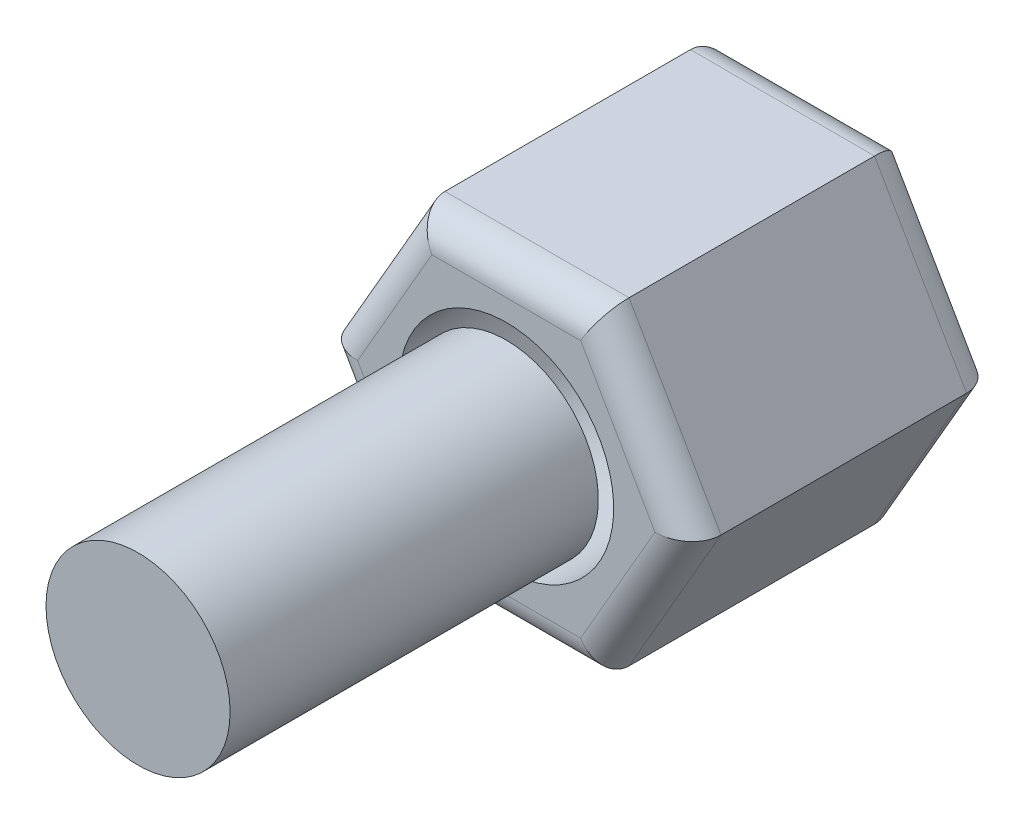
ISO-10303-21;
HEADER;
FILE_DESCRIPTION(('STEP AP214'),'2;1');
FILE_NAME('part.step','',(''),(''),'','','');
FILE_SCHEMA(('AUTOMOTIVE_DESIGN { 1 0 10303 214 1 1 1 1 }'));
ENDSEC;
DATA;
#1=APPLICATION_CONTEXT('core data for automotive mechanical design processes');
#2=APPLICATION_PROTOCOL_DEFINITION('international standard','automotive_design',2000,#1);
#3=PRODUCT_CONTEXT('',#1,'mechanical');
#4=PRODUCT('Part','Part','',(#3));
#5=PRODUCT_RELATED_PRODUCT_CATEGORY('part','',(#4));
#6=PRODUCT_DEFINITION_FORMATION('','',#4);
#7=PRODUCT_DEFINITION_CONTEXT('part definition',#1,'design');
#8=PRODUCT_DEFINITION('design','',#6,#7);
#9=PRODUCT_DEFINITION_SHAPE('','',#8);
#10=(LENGTH_UNIT() NAMED_UNIT(*) SI_UNIT(.MILLI.,.METRE.));
#11=(NAMED_UNIT(*) PLANE_ANGLE_UNIT() SI_UNIT($,.RADIAN.));
#12=(NAMED_UNIT(*) SI_UNIT($,.STERADIAN.) SOLID_ANGLE_UNIT());
#13=UNCERTAINTY_MEASURE_WITH_UNIT(LENGTH_MEASURE(1.E-05),#10,'distance_accuracy_value','');
#14=(GEOMETRIC_REPRESENTATION_CONTEXT(3) GLOBAL_UNCERTAINTY_ASSIGNED_CONTEXT((#13)) GLOBAL_UNIT_ASSIGNED_CONTEXT((#10,
#11,#12)) REPRESENTATION_CONTEXT('',''));
#15=CARTESIAN_POINT('',(0.,0.,0.));
#16=DIRECTION('',(0.,0.,1.));
#17=DIRECTION('',(1.,0.,0.));
#18=AXIS2_PLACEMENT_3D('',#15,#16,#17);
#19=CARTESIAN_POINT('',(0.,0.,5.));
#20=DIRECTION('',(0.,0.,1.));
#21=DIRECTION('',(1.,0.,0.));
#22=AXIS2_PLACEMENT_3D('',#19,#20,#21);
#23=PLANE('',#22);
#24=DIRECTION('',(1.,0.,0.));
#25=VECTOR('',#24,1.);
#26=CARTESIAN_POINT('',(1.5,-2.09807621135332,5.));
#27=LINE('',#26,#25);
#28=CARTESIAN_POINT('',(-1.21132486540518,-2.09807621135332,5.));
#29=VERTEX_POINT('',#28);
#30=CARTESIAN_POINT('',(1.21132486540519,-2.09807621135332,5.));
#31=VERTEX_POINT('',#30);
#32=EDGE_CURVE('E50',#29,#31,#27,.T.);
#33=ORIENTED_EDGE('',*,*,#32,.T.);
#34=DIRECTION('',(0.5,0.866025403784439,0.));
#35=VECTOR('',#34,1.);
#36=CARTESIAN_POINT('',(2.56698729810778,0.25,5.));
#37=LINE('',#36,#35);
#38=CARTESIAN_POINT('',(2.42264973081037,0.,5.));
#39=VERTEX_POINT('',#38);
#40=EDGE_CURVE('E12',#31,#39,#37,.T.);
#41=ORIENTED_EDGE('',*,*,#40,.T.);
#42=DIRECTION('',(-0.5,0.866025403784439,0.));
#43=VECTOR('',#42,1.);
#44=CARTESIAN_POINT('',(1.06698729810778,2.34807621135332,5.));
#45=LINE('',#44,#43);
#46=CARTESIAN_POINT('',(1.21132486540518,2.09807621135332,5.));
#47=VERTEX_POINT('',#46);
#48=EDGE_CURVE('E199',#39,#47,#45,.T.);
#49=ORIENTED_EDGE('',*,*,#48,.T.);
#50=DIRECTION('',(-1.,0.,0.));
#51=VECTOR('',#50,1.);
#52=CARTESIAN_POINT('',(-1.49999999999999,2.09807621135332,5.));
#53=LINE('',#52,#51);
#54=CARTESIAN_POINT('',(-1.21132486540518,2.09807621135332,5.));
#55=VERTEX_POINT('',#54);
#56=EDGE_CURVE('E197',#47,#55,#53,.T.);
#57=ORIENTED_EDGE('',*,*,#56,.T.);
#58=DIRECTION('',(-0.5,-0.866025403784439,0.));
#59=VECTOR('',#58,1.);
#60=CARTESIAN_POINT('',(-2.56698729810778,-0.250000000000003,5.));
#61=LINE('',#60,#59);
#62=CARTESIAN_POINT('',(-2.42264973081037,0.,5.));
#63=VERTEX_POINT('',#62);
#64=EDGE_CURVE('E195',#55,#63,#61,.T.);
#65=ORIENTED_EDGE('',*,*,#64,.T.);
#66=DIRECTION('',(0.5,-0.866025403784439,0.));
#67=VECTOR('',#66,1.);
#68=CARTESIAN_POINT('',(-1.06698729810778,-2.34807621135332,5.));
#69=LINE('',#68,#67);
#70=EDGE_CURVE('E61',#63,#29,#69,.T.);
#71=ORIENTED_EDGE('',*,*,#70,.T.);
#72=EDGE_LOOP('',(#33,#41,#49,#57,#65,#71));
#73=FACE_BOUND('',#72,.T.);
#74=CARTESIAN_POINT('',(0.,0.,5.));
#75=DIRECTION('',(0.,0.,-1.));
#76=DIRECTION('',(-1.,0.,0.));
#77=AXIS2_PLACEMENT_3D('',#74,#75,#76);
#78=CIRCLE('',#77,1.75);
#79=CARTESIAN_POINT('',(-1.75,0.,5.));
#80=VERTEX_POINT('',#79);
#81=EDGE_CURVE('E182',#80,#80,#78,.T.);
#82=ORIENTED_EDGE('',*,*,#81,.T.);
#83=EDGE_LOOP('',(#82));
#84=FACE_BOUND('',#83,.T.);
#85=ADVANCED_FACE('F41',(#73,#84),#23,.T.);
#86=CARTESIAN_POINT('',(1.5,-2.59807621135332,5.));
#87=DIRECTION('',(-0.866025403784439,0.5,0.));
#88=DIRECTION('',(-0.5,-0.866025403784439,0.));
#89=AXIS2_PLACEMENT_3D('',#86,#87,#88);
#90=PLANE('',#89);
#91=DIRECTION('',(0.,0.,-1.));
#92=VECTOR('',#91,1.);
#93=CARTESIAN_POINT('',(1.5,-2.59807621135332,5.));
#94=LINE('',#93,#92);
#95=CARTESIAN_POINT('',(1.5,-2.59807621135332,4.5));
#96=VERTEX_POINT('',#95);
#97=CARTESIAN_POINT('',(1.5,-2.59807621135332,0.5));
#98=VERTEX_POINT('',#97);
#99=EDGE_CURVE('E234',#96,#98,#94,.T.);
#100=ORIENTED_EDGE('',*,*,#99,.T.);
#101=DIRECTION('',(0.5,0.866025403784439,0.));
#102=VECTOR('',#101,1.);
#103=CARTESIAN_POINT('',(1.5,-2.59807621135332,0.5));
#104=LINE('',#103,#102);
#105=CARTESIAN_POINT('',(3.,0.,0.5));
#106=VERTEX_POINT('',#105);
#107=EDGE_CURVE('E141',#98,#106,#104,.T.);
#108=ORIENTED_EDGE('',*,*,#107,.T.);
#109=DIRECTION('',(0.,0.,-1.));
#110=VECTOR('',#109,1.);
#111=CARTESIAN_POINT('',(3.,0.,5.));
#112=LINE('',#111,#110);
#113=CARTESIAN_POINT('',(3.,0.,4.5));
#114=VERTEX_POINT('',#113);
#115=EDGE_CURVE('E239',#114,#106,#112,.T.);
#116=ORIENTED_EDGE('',*,*,#115,.F.);
#117=DIRECTION('',(0.5,0.866025403784439,0.));
#118=VECTOR('',#117,1.);
#119=CARTESIAN_POINT('',(1.5,-2.59807621135332,4.5));
#120=LINE('',#119,#118);
#121=EDGE_CURVE('E207',#114,#96,#120,.F.);
#122=ORIENTED_EDGE('',*,*,#121,.T.);
#123=EDGE_LOOP('',(#100,#108,#116,#122));
#124=FACE_BOUND('',#123,.T.);
#125=ADVANCED_FACE('F282',(#124),#90,.F.);
#126=CARTESIAN_POINT('',(3.,0.,5.));
#127=DIRECTION('',(-0.866025403784439,-0.5,0.));
#128=DIRECTION('',(0.5,-0.866025403784439,0.));
#129=AXIS2_PLACEMENT_3D('',#126,#127,#128);
#130=PLANE('',#129);
#131=ORIENTED_EDGE('',*,*,#115,.T.);
#132=DIRECTION('',(-0.5,0.866025403784439,0.));
#133=VECTOR('',#132,1.);
#134=CARTESIAN_POINT('',(3.,0.,0.5));
#135=LINE('',#134,#133);
#136=CARTESIAN_POINT('',(1.5,2.59807621135332,0.5));
#137=VERTEX_POINT('',#136);
#138=EDGE_CURVE('E210',#106,#137,#135,.T.);
#139=ORIENTED_EDGE('',*,*,#138,.T.);
#140=DIRECTION('',(0.,0.,-1.));
#141=VECTOR('',#140,1.);
#142=CARTESIAN_POINT('',(1.5,2.59807621135332,5.));
#143=LINE('',#142,#141);
#144=CARTESIAN_POINT('',(1.5,2.59807621135332,4.5));
#145=VERTEX_POINT('',#144);
#146=EDGE_CURVE('E242',#145,#137,#143,.T.);
#147=ORIENTED_EDGE('',*,*,#146,.F.);
#148=DIRECTION('',(-0.5,0.866025403784439,0.));
#149=VECTOR('',#148,1.);
#150=CARTESIAN_POINT('',(3.,0.,4.5));
#151=LINE('',#150,#149);
#152=EDGE_CURVE('E212',#145,#114,#151,.F.);
#153=ORIENTED_EDGE('',*,*,#152,.T.);
#154=EDGE_LOOP('',(#131,#139,#147,#153));
#155=FACE_BOUND('',#154,.T.);
#156=ADVANCED_FACE('F249',(#155),#130,.F.);
#157=CARTESIAN_POINT('',(1.5,2.59807621135332,5.));
#158=DIRECTION('',(0.,-1.,0.));
#159=DIRECTION('',(0.,0.,-1.));
#160=AXIS2_PLACEMENT_3D('',#157,#158,#159);
#161=PLANE('',#160);
#162=ORIENTED_EDGE('',*,*,#146,.T.);
#163=DIRECTION('',(-1.,0.,0.));
#164=VECTOR('',#163,1.);
#165=CARTESIAN_POINT('',(1.5,2.59807621135332,0.5));
#166=LINE('',#165,#164);
#167=CARTESIAN_POINT('',(-1.49999999999999,2.59807621135332,0.5));
#168=VERTEX_POINT('',#167);
#169=EDGE_CURVE('E214',#137,#168,#166,.T.);
#170=ORIENTED_EDGE('',*,*,#169,.T.);
#171=DIRECTION('',(0.,0.,-1.));
#172=VECTOR('',#171,1.);
#173=CARTESIAN_POINT('',(-1.49999999999999,2.59807621135332,5.));
#174=LINE('',#173,#172);
#175=CARTESIAN_POINT('',(-1.49999999999999,2.59807621135332,4.5));
#176=VERTEX_POINT('',#175);
#177=EDGE_CURVE('E152',#176,#168,#174,.T.);
#178=ORIENTED_EDGE('',*,*,#177,.F.);
#179=DIRECTION('',(-1.,0.,0.));
#180=VECTOR('',#179,1.);
#181=CARTESIAN_POINT('',(1.5,2.59807621135332,4.5));
#182=LINE('',#181,#180);
#183=EDGE_CURVE('E216',#176,#145,#182,.F.);
#184=ORIENTED_EDGE('',*,*,#183,.T.);
#185=EDGE_LOOP('',(#162,#170,#178,#184));
#186=FACE_BOUND('',#185,.T.);
#187=ADVANCED_FACE('F270',(#186),#161,.F.);
#188=CARTESIAN_POINT('',(-1.49999999999999,2.59807621135332,5.));
#189=DIRECTION('',(0.866025403784439,-0.5,0.));
#190=DIRECTION('',(0.5,0.866025403784439,0.));
#191=AXIS2_PLACEMENT_3D('',#188,#189,#190);
#192=PLANE('',#191);
#193=ORIENTED_EDGE('',*,*,#177,.T.);
#194=DIRECTION('',(-0.5,-0.866025403784439,0.));
#195=VECTOR('',#194,1.);
#196=CARTESIAN_POINT('',(-1.49999999999999,2.59807621135332,0.5));
#197=LINE('',#196,#195);
#198=CARTESIAN_POINT('',(-3.,0.,0.5));
#199=VERTEX_POINT('',#198);
#200=EDGE_CURVE('E151',#168,#199,#197,.T.);
#201=ORIENTED_EDGE('',*,*,#200,.T.);
#202=DIRECTION('',(0.,0.,-1.));
#203=VECTOR('',#202,1.);
#204=CARTESIAN_POINT('',(-3.,0.,5.));
#205=LINE('',#204,#203);
#206=CARTESIAN_POINT('',(-3.,0.,4.5));
#207=VERTEX_POINT('',#206);
#208=EDGE_CURVE('E134',#207,#199,#205,.T.);
#209=ORIENTED_EDGE('',*,*,#208,.F.);
#210=DIRECTION('',(-0.5,-0.866025403784439,0.));
#211=VECTOR('',#210,1.);
#212=CARTESIAN_POINT('',(-1.49999999999999,2.59807621135332,4.5));
#213=LINE('',#212,#211);
#214=EDGE_CURVE('E148',#207,#176,#213,.F.);
#215=ORIENTED_EDGE('',*,*,#214,.T.);
#216=EDGE_LOOP('',(#193,#201,#209,#215));
#217=FACE_BOUND('',#216,.T.);
#218=ADVANCED_FACE('F147',(#217),#192,.F.);
#219=CARTESIAN_POINT('',(-3.,0.,5.));
#220=DIRECTION('',(0.866025403784439,0.5,0.));
#221=DIRECTION('',(-0.5,0.866025403784439,0.));
#222=AXIS2_PLACEMENT_3D('',#219,#220,#221);
#223=PLANE('',#222);
#224=ORIENTED_EDGE('',*,*,#208,.T.);
#225=DIRECTION('',(0.5,-0.866025403784439,0.));
#226=VECTOR('',#225,1.);
#227=CARTESIAN_POINT('',(-3.,0.,0.5));
#228=LINE('',#227,#226);
#229=CARTESIAN_POINT('',(-1.5,-2.59807621135332,0.5));
#230=VERTEX_POINT('',#229);
#231=EDGE_CURVE('E140',#199,#230,#228,.T.);
#232=ORIENTED_EDGE('',*,*,#231,.T.);
#233=DIRECTION('',(0.,0.,-1.));
#234=VECTOR('',#233,1.);
#235=CARTESIAN_POINT('',(-1.5,-2.59807621135332,5.));
#236=LINE('',#235,#234);
#237=CARTESIAN_POINT('',(-1.5,-2.59807621135332,4.5));
#238=VERTEX_POINT('',#237);
#239=EDGE_CURVE('E136',#238,#230,#236,.T.);
#240=ORIENTED_EDGE('',*,*,#239,.F.);
#241=DIRECTION('',(0.5,-0.866025403784439,0.));
#242=VECTOR('',#241,1.);
#243=CARTESIAN_POINT('',(-3.,0.,4.5));
#244=LINE('',#243,#242);
#245=EDGE_CURVE('E131',#238,#207,#244,.F.);
#246=ORIENTED_EDGE('',*,*,#245,.T.);
#247=EDGE_LOOP('',(#224,#232,#240,#246));
#248=FACE_BOUND('',#247,.T.);
#249=ADVANCED_FACE('F133',(#248),#223,.F.);
#250=CARTESIAN_POINT('',(-1.5,-2.59807621135332,5.));
#251=DIRECTION('',(0.,1.,0.));
#252=DIRECTION('',(0.,0.,1.));
#253=AXIS2_PLACEMENT_3D('',#250,#251,#252);
#254=PLANE('',#253);
#255=ORIENTED_EDGE('',*,*,#239,.T.);
#256=DIRECTION('',(1.,0.,0.));
#257=VECTOR('',#256,1.);
#258=CARTESIAN_POINT('',(-1.5,-2.59807621135332,0.5));
#259=LINE('',#258,#257);
#260=EDGE_CURVE('E201',#230,#98,#259,.T.);
#261=ORIENTED_EDGE('',*,*,#260,.T.);
#262=ORIENTED_EDGE('',*,*,#99,.F.);
#263=DIRECTION('',(1.,0.,0.));
#264=VECTOR('',#263,1.);
#265=CARTESIAN_POINT('',(-1.5,-2.59807621135332,4.5));
#266=LINE('',#265,#264);
#267=EDGE_CURVE('E203',#96,#238,#266,.F.);
#268=ORIENTED_EDGE('',*,*,#267,.T.);
#269=EDGE_LOOP('',(#255,#261,#262,#268));
#270=FACE_BOUND('',#269,.T.);
#271=ADVANCED_FACE('F284',(#270),#254,.F.);
#272=CARTESIAN_POINT('',(0.,0.,0.));
#273=DIRECTION('',(0.,0.,1.));
#274=DIRECTION('',(1.,0.,0.));
#275=AXIS2_PLACEMENT_3D('',#272,#273,#274);
#276=PLANE('',#275);
#277=DIRECTION('',(0.5,-0.866025403784439,0.));
#278=VECTOR('',#277,1.);
#279=CARTESIAN_POINT('',(-1.81698729810778,-1.04903810567666,0.));
#280=LINE('',#279,#278);
#281=CARTESIAN_POINT('',(-1.21132486540518,-2.09807621135332,0.));
#282=VERTEX_POINT('',#281);
#283=CARTESIAN_POINT('',(-2.42264973081037,0.,0.));
#284=VERTEX_POINT('',#283);
#285=EDGE_CURVE('E227',#282,#284,#280,.F.);
#286=ORIENTED_EDGE('',*,*,#285,.T.);
#287=DIRECTION('',(-0.5,-0.866025403784439,0.));
#288=VECTOR('',#287,1.);
#289=CARTESIAN_POINT('',(-1.81698729810778,1.04903810567665,0.));
#290=LINE('',#289,#288);
#291=CARTESIAN_POINT('',(-1.21132486540518,2.09807621135332,0.));
#292=VERTEX_POINT('',#291);
#293=EDGE_CURVE('E218',#284,#292,#290,.F.);
#294=ORIENTED_EDGE('',*,*,#293,.T.);
#295=DIRECTION('',(-1.,0.,0.));
#296=VECTOR('',#295,1.);
#297=CARTESIAN_POINT('',(0.,2.09807621135332,0.));
#298=LINE('',#297,#296);
#299=CARTESIAN_POINT('',(1.21132486540519,2.09807621135332,0.));
#300=VERTEX_POINT('',#299);
#301=EDGE_CURVE('E221',#292,#300,#298,.F.);
#302=ORIENTED_EDGE('',*,*,#301,.T.);
#303=DIRECTION('',(-0.5,0.866025403784439,0.));
#304=VECTOR('',#303,1.);
#305=CARTESIAN_POINT('',(1.81698729810778,1.04903810567666,0.));
#306=LINE('',#305,#304);
#307=CARTESIAN_POINT('',(2.42264973081037,0.,0.));
#308=VERTEX_POINT('',#307);
#309=EDGE_CURVE('E223',#300,#308,#306,.F.);
#310=ORIENTED_EDGE('',*,*,#309,.T.);
#311=DIRECTION('',(0.5,0.866025403784439,0.));
#312=VECTOR('',#311,1.);
#313=CARTESIAN_POINT('',(1.81698729810778,-1.04903810567666,0.));
#314=LINE('',#313,#312);
#315=CARTESIAN_POINT('',(1.21132486540519,-2.09807621135332,0.));
#316=VERTEX_POINT('',#315);
#317=EDGE_CURVE('E225',#308,#316,#314,.F.);
#318=ORIENTED_EDGE('',*,*,#317,.T.);
#319=DIRECTION('',(1.,0.,0.));
#320=VECTOR('',#319,1.);
#321=CARTESIAN_POINT('',(0.,-2.09807621135332,0.));
#322=LINE('',#321,#320);
#323=EDGE_CURVE('E229',#316,#282,#322,.F.);
#324=ORIENTED_EDGE('',*,*,#323,.T.);
#325=EDGE_LOOP('',(#286,#294,#302,#310,#318,#324));
#326=FACE_BOUND('',#325,.T.);
#327=CARTESIAN_POINT('',(0.,0.,0.));
#328=DIRECTION('',(0.,0.,-1.));
#329=DIRECTION('',(-1.,0.,0.));
#330=AXIS2_PLACEMENT_3D('',#327,#328,#329);
#331=CIRCLE('',#330,1.75);
#332=CARTESIAN_POINT('',(-1.75,0.,0.));
#333=VERTEX_POINT('',#332);
#334=EDGE_CURVE('E161',#333,#333,#331,.T.);
#335=ORIENTED_EDGE('',*,*,#334,.F.);
#336=EDGE_LOOP('',(#335));
#337=FACE_BOUND('',#336,.T.);
#338=ADVANCED_FACE('F297',(#326,#337),#276,.F.);
#339=CARTESIAN_POINT('',(0.,0.,5.));
#340=DIRECTION('',(0.,0.,-1.));
#341=DIRECTION('',(-1.,0.,0.));
#342=AXIS2_PLACEMENT_3D('',#339,#340,#341);
#343=CYLINDRICAL_SURFACE('',#342,1.75);
#344=ORIENTED_EDGE('',*,*,#81,.F.);
#345=EDGE_LOOP('',(#344));
#346=FACE_BOUND('',#345,.T.);
#347=ORIENTED_EDGE('',*,*,#334,.T.);
#348=EDGE_LOOP('',(#347));
#349=FACE_BOUND('',#348,.T.);
#350=ADVANCED_FACE('F318',(#346,#349),#343,.F.);
#351=CARTESIAN_POINT('',(1.06698729810778,-2.34807621135332,0.5));
#352=DIRECTION('',(0.5,0.866025403784439,0.));
#353=DIRECTION('',(-0.866025403784439,0.5,0.));
#354=AXIS2_PLACEMENT_3D('',#351,#352,#353);
#355=CYLINDRICAL_SURFACE('',#354,0.5);
#356=CARTESIAN_POINT('',(1.21132486540519,-2.09807621135332,0.5));
#357=DIRECTION('',(0.866025403784438,0.5,0.));
#358=DIRECTION('',(0.5,-0.866025403784439,0.));
#359=AXIS2_PLACEMENT_3D('',#356,#357,#358);
#360=ELLIPSE('',#359,0.577350269189626,0.5);
#361=EDGE_CURVE('E183',#316,#98,#360,.F.);
#362=ORIENTED_EDGE('',*,*,#361,.F.);
#363=ORIENTED_EDGE('',*,*,#317,.F.);
#364=CARTESIAN_POINT('',(2.42264973081037,0.,0.5));
#365=DIRECTION('',(0.,1.,0.));
#366=DIRECTION('',(1.,0.,0.));
#367=AXIS2_PLACEMENT_3D('',#364,#365,#366);
#368=ELLIPSE('',#367,0.577350269189626,0.5);
#369=EDGE_CURVE('E179',#106,#308,#368,.T.);
#370=ORIENTED_EDGE('',*,*,#369,.F.);
#371=ORIENTED_EDGE('',*,*,#107,.F.);
#372=EDGE_LOOP('',(#362,#363,#370,#371));
#373=FACE_BOUND('',#372,.T.);
#374=ADVANCED_FACE('F259',(#373),#355,.T.);
#375=CARTESIAN_POINT('',(2.56698729810778,-0.25,0.5));
#376=DIRECTION('',(-0.5,0.866025403784439,0.));
#377=DIRECTION('',(-0.866025403784439,-0.5,0.));
#378=AXIS2_PLACEMENT_3D('',#375,#376,#377);
#379=CYLINDRICAL_SURFACE('',#378,0.5);
#380=ORIENTED_EDGE('',*,*,#369,.T.);
#381=ORIENTED_EDGE('',*,*,#309,.F.);
#382=CARTESIAN_POINT('',(1.21132486540519,2.09807621135332,0.5));
#383=DIRECTION('',(-0.866025403784439,0.5,0.));
#384=DIRECTION('',(0.5,0.866025403784439,0.));
#385=AXIS2_PLACEMENT_3D('',#382,#383,#384);
#386=ELLIPSE('',#385,0.577350269189626,0.5);
#387=EDGE_CURVE('E186',#137,#300,#386,.T.);
#388=ORIENTED_EDGE('',*,*,#387,.F.);
#389=ORIENTED_EDGE('',*,*,#138,.F.);
#390=EDGE_LOOP('',(#380,#381,#388,#389));
#391=FACE_BOUND('',#390,.T.);
#392=ADVANCED_FACE('F263',(#391),#379,.T.);
#393=CARTESIAN_POINT('',(-1.5,-2.09807621135332,0.5));
#394=DIRECTION('',(1.,0.,0.));
#395=DIRECTION('',(0.,0.,-1.));
#396=AXIS2_PLACEMENT_3D('',#393,#394,#395);
#397=CYLINDRICAL_SURFACE('',#396,0.5);
#398=ORIENTED_EDGE('',*,*,#361,.T.);
#399=ORIENTED_EDGE('',*,*,#260,.F.);
#400=CARTESIAN_POINT('',(-1.21132486540518,-2.09807621135332,0.5));
#401=DIRECTION('',(0.866025403784439,-0.5,0.));
#402=DIRECTION('',(0.5,0.866025403784439,0.));
#403=AXIS2_PLACEMENT_3D('',#400,#401,#402);
#404=ELLIPSE('',#403,0.577350269189626,0.5);
#405=EDGE_CURVE('E189',#282,#230,#404,.F.);
#406=ORIENTED_EDGE('',*,*,#405,.F.);
#407=ORIENTED_EDGE('',*,*,#323,.F.);
#408=EDGE_LOOP('',(#398,#399,#406,#407));
#409=FACE_BOUND('',#408,.T.);
#410=ADVANCED_FACE('F288',(#409),#397,.T.);
#411=CARTESIAN_POINT('',(1.5,2.09807621135332,0.5));
#412=DIRECTION('',(-1.,0.,0.));
#413=DIRECTION('',(0.,0.,1.));
#414=AXIS2_PLACEMENT_3D('',#411,#412,#413);
#415=CYLINDRICAL_SURFACE('',#414,0.5);
#416=ORIENTED_EDGE('',*,*,#387,.T.);
#417=ORIENTED_EDGE('',*,*,#301,.F.);
#418=CARTESIAN_POINT('',(-1.21132486540518,2.09807621135332,0.5));
#419=DIRECTION('',(-0.866025403784438,-0.5,0.));
#420=DIRECTION('',(-0.5,0.866025403784439,0.));
#421=AXIS2_PLACEMENT_3D('',#418,#419,#420);
#422=ELLIPSE('',#421,0.577350269189626,0.5);
#423=EDGE_CURVE('E165',#168,#292,#422,.T.);
#424=ORIENTED_EDGE('',*,*,#423,.F.);
#425=ORIENTED_EDGE('',*,*,#169,.F.);
#426=EDGE_LOOP('',(#416,#417,#424,#425));
#427=FACE_BOUND('',#426,.T.);
#428=ADVANCED_FACE('F268',(#427),#415,.T.);
#429=CARTESIAN_POINT('',(-2.56698729810778,0.249999999999996,0.5));
#430=DIRECTION('',(0.5,-0.866025403784439,0.));
#431=DIRECTION('',(0.866025403784439,0.5,0.));
#432=AXIS2_PLACEMENT_3D('',#429,#430,#431);
#433=CYLINDRICAL_SURFACE('',#432,0.5);
#434=ORIENTED_EDGE('',*,*,#405,.T.);
#435=ORIENTED_EDGE('',*,*,#231,.F.);
#436=CARTESIAN_POINT('',(-2.42264973081037,0.,0.5));
#437=DIRECTION('',(0.,-1.,0.));
#438=DIRECTION('',(1.,0.,0.));
#439=AXIS2_PLACEMENT_3D('',#436,#437,#438);
#440=ELLIPSE('',#439,0.577350269189626,0.5);
#441=EDGE_CURVE('E164',#284,#199,#440,.F.);
#442=ORIENTED_EDGE('',*,*,#441,.F.);
#443=ORIENTED_EDGE('',*,*,#285,.F.);
#444=EDGE_LOOP('',(#434,#435,#442,#443));
#445=FACE_BOUND('',#444,.T.);
#446=ADVANCED_FACE('F293',(#445),#433,.T.);
#447=CARTESIAN_POINT('',(-1.06698729810778,2.34807621135332,0.5));
#448=DIRECTION('',(-0.5,-0.866025403784439,0.));
#449=DIRECTION('',(0.866025403784439,-0.5,0.));
#450=AXIS2_PLACEMENT_3D('',#447,#448,#449);
#451=CYLINDRICAL_SURFACE('',#450,0.5);
#452=ORIENTED_EDGE('',*,*,#423,.T.);
#453=ORIENTED_EDGE('',*,*,#293,.F.);
#454=ORIENTED_EDGE('',*,*,#441,.T.);
#455=ORIENTED_EDGE('',*,*,#200,.F.);
#456=EDGE_LOOP('',(#452,#453,#454,#455));
#457=FACE_BOUND('',#456,.T.);
#458=ADVANCED_FACE('F300',(#457),#451,.T.);
#459=CARTESIAN_POINT('',(-1.81698729810778,1.04903810567665,4.5));
#460=DIRECTION('',(0.5,0.866025403784439,0.));
#461=DIRECTION('',(-0.866025403784439,0.5,0.));
#462=AXIS2_PLACEMENT_3D('',#459,#460,#461);
#463=CYLINDRICAL_SURFACE('',#462,0.5);
#464=CARTESIAN_POINT('',(-1.21132486540518,2.09807621135332,4.5));
#465=DIRECTION('',(0.866025403784438,0.5,0.));
#466=DIRECTION('',(0.5,-0.866025403784439,0.));
#467=AXIS2_PLACEMENT_3D('',#464,#465,#466);
#468=ELLIPSE('',#467,0.577350269189626,0.5);
#469=EDGE_CURVE('E159',#176,#55,#468,.T.);
#470=ORIENTED_EDGE('',*,*,#469,.F.);
#471=ORIENTED_EDGE('',*,*,#214,.F.);
#472=CARTESIAN_POINT('',(-2.42264973081037,0.,4.5));
#473=DIRECTION('',(0.,1.,0.));
#474=DIRECTION('',(1.,0.,0.));
#475=AXIS2_PLACEMENT_3D('',#472,#473,#474);
#476=ELLIPSE('',#475,0.577350269189626,0.5);
#477=EDGE_CURVE('E45',#63,#207,#476,.F.);
#478=ORIENTED_EDGE('',*,*,#477,.F.);
#479=ORIENTED_EDGE('',*,*,#64,.F.);
#480=EDGE_LOOP('',(#470,#471,#478,#479));
#481=FACE_BOUND('',#480,.T.);
#482=ADVANCED_FACE('F43',(#481),#463,.T.);
#483=CARTESIAN_POINT('',(-1.81698729810778,-1.04903810567666,4.5));
#484=DIRECTION('',(-0.5,0.866025403784439,0.));
#485=DIRECTION('',(-0.866025403784439,-0.5,0.));
#486=AXIS2_PLACEMENT_3D('',#483,#484,#485);
#487=CYLINDRICAL_SURFACE('',#486,0.5);
#488=ORIENTED_EDGE('',*,*,#477,.T.);
#489=ORIENTED_EDGE('',*,*,#245,.F.);
#490=CARTESIAN_POINT('',(-1.21132486540518,-2.09807621135332,4.5));
#491=DIRECTION('',(-0.866025403784439,0.5,0.));
#492=DIRECTION('',(0.5,0.866025403784439,0.));
#493=AXIS2_PLACEMENT_3D('',#490,#491,#492);
#494=ELLIPSE('',#493,0.577350269189626,0.5);
#495=EDGE_CURVE('E167',#29,#238,#494,.F.);
#496=ORIENTED_EDGE('',*,*,#495,.F.);
#497=ORIENTED_EDGE('',*,*,#70,.F.);
#498=EDGE_LOOP('',(#488,#489,#496,#497));
#499=FACE_BOUND('',#498,.T.);
#500=ADVANCED_FACE('F163',(#499),#487,.T.);
#501=CARTESIAN_POINT('',(0.,2.09807621135332,4.5));
#502=DIRECTION('',(1.,0.,0.));
#503=DIRECTION('',(0.,0.,-1.));
#504=AXIS2_PLACEMENT_3D('',#501,#502,#503);
#505=CYLINDRICAL_SURFACE('',#504,0.5);
#506=ORIENTED_EDGE('',*,*,#469,.T.);
#507=ORIENTED_EDGE('',*,*,#56,.F.);
#508=CARTESIAN_POINT('',(1.21132486540518,2.09807621135332,4.5));
#509=DIRECTION('',(0.866025403784439,-0.5,0.));
#510=DIRECTION('',(-0.5,-0.866025403784439,0.));
#511=AXIS2_PLACEMENT_3D('',#508,#509,#510);
#512=ELLIPSE('',#511,0.577350269189626,0.5);
#513=EDGE_CURVE('E170',#145,#47,#512,.T.);
#514=ORIENTED_EDGE('',*,*,#513,.F.);
#515=ORIENTED_EDGE('',*,*,#183,.F.);
#516=EDGE_LOOP('',(#506,#507,#514,#515));
#517=FACE_BOUND('',#516,.T.);
#518=ADVANCED_FACE('F272',(#517),#505,.T.);
#519=CARTESIAN_POINT('',(0.,-2.09807621135332,4.5));
#520=DIRECTION('',(-1.,0.,0.));
#521=DIRECTION('',(0.,0.,1.));
#522=AXIS2_PLACEMENT_3D('',#519,#520,#521);
#523=CYLINDRICAL_SURFACE('',#522,0.5);
#524=ORIENTED_EDGE('',*,*,#495,.T.);
#525=ORIENTED_EDGE('',*,*,#267,.F.);
#526=CARTESIAN_POINT('',(1.21132486540519,-2.09807621135332,4.5));
#527=DIRECTION('',(-0.866025403784438,-0.5,0.));
#528=DIRECTION('',(-0.5,0.866025403784439,0.));
#529=AXIS2_PLACEMENT_3D('',#526,#527,#528);
#530=ELLIPSE('',#529,0.577350269189626,0.5);
#531=EDGE_CURVE('E175',#31,#96,#530,.F.);
#532=ORIENTED_EDGE('',*,*,#531,.F.);
#533=ORIENTED_EDGE('',*,*,#32,.F.);
#534=EDGE_LOOP('',(#524,#525,#532,#533));
#535=FACE_BOUND('',#534,.T.);
#536=ADVANCED_FACE('F429',(#535),#523,.T.);
#537=CARTESIAN_POINT('',(1.81698729810778,1.04903810567666,4.5));
#538=DIRECTION('',(0.5,-0.866025403784439,0.));
#539=DIRECTION('',(0.866025403784439,0.5,0.));
#540=AXIS2_PLACEMENT_3D('',#537,#538,#539);
#541=CYLINDRICAL_SURFACE('',#540,0.5);
#542=ORIENTED_EDGE('',*,*,#513,.T.);
#543=ORIENTED_EDGE('',*,*,#48,.F.);
#544=CARTESIAN_POINT('',(2.42264973081037,0.,4.5));
#545=DIRECTION('',(0.,-1.,0.));
#546=DIRECTION('',(1.,0.,0.));
#547=AXIS2_PLACEMENT_3D('',#544,#545,#546);
#548=ELLIPSE('',#547,0.577350269189626,0.5);
#549=EDGE_CURVE('E177',#114,#39,#548,.T.);
#550=ORIENTED_EDGE('',*,*,#549,.F.);
#551=ORIENTED_EDGE('',*,*,#152,.F.);
#552=EDGE_LOOP('',(#542,#543,#550,#551));
#553=FACE_BOUND('',#552,.T.);
#554=ADVANCED_FACE('F276',(#553),#541,.T.);
#555=CARTESIAN_POINT('',(1.81698729810778,-1.04903810567666,4.5));
#556=DIRECTION('',(-0.5,-0.866025403784439,0.));
#557=DIRECTION('',(0.866025403784439,-0.5,0.));
#558=AXIS2_PLACEMENT_3D('',#555,#556,#557);
#559=CYLINDRICAL_SURFACE('',#558,0.5);
#560=ORIENTED_EDGE('',*,*,#531,.T.);
#561=ORIENTED_EDGE('',*,*,#121,.F.);
#562=ORIENTED_EDGE('',*,*,#549,.T.);
#563=ORIENTED_EDGE('',*,*,#40,.F.);
#564=EDGE_LOOP('',(#560,#561,#562,#563));
#565=FACE_BOUND('',#564,.T.);
#566=ADVANCED_FACE('F279',(#565),#559,.T.);
#567=CLOSED_SHELL('',(#85,#125,#156,#187,#218,#249,#271,#338,#350,#374,#392,#410,#428,#446,#458,
#482,#500,#518,#536,#554,#566));
#568=MANIFOLD_SOLID_BREP('B2',#567);
#569=CARTESIAN_POINT('',(0.,0.,11.));
#570=DIRECTION('',(0.,0.,1.));
#571=DIRECTION('',(1.,0.,0.));
#572=AXIS2_PLACEMENT_3D('',#569,#570,#571);
#573=PLANE('',#572);
#574=CARTESIAN_POINT('',(0.,0.,11.));
#575=DIRECTION('',(0.,0.,1.));
#576=DIRECTION('',(1.,0.,0.));
#577=AXIS2_PLACEMENT_3D('',#574,#575,#576);
#578=CIRCLE('',#577,1.5);
#579=CARTESIAN_POINT('',(1.5,0.,11.));
#580=VERTEX_POINT('',#579);
#581=EDGE_CURVE('E40',#580,#580,#578,.T.);
#582=ORIENTED_EDGE('',*,*,#581,.T.);
#583=EDGE_LOOP('',(#582));
#584=FACE_BOUND('',#583,.T.);
#585=ADVANCED_FACE('F478',(#584),#573,.T.);
#586=CARTESIAN_POINT('',(0.,0.,11.));
#587=DIRECTION('',(0.,0.,-1.));
#588=DIRECTION('',(-1.,0.,0.));
#589=AXIS2_PLACEMENT_3D('',#586,#587,#588);
#590=CYLINDRICAL_SURFACE('',#589,1.5);
#591=ORIENTED_EDGE('',*,*,#581,.F.);
#592=EDGE_LOOP('',(#591));
#593=FACE_BOUND('',#592,.T.);
#594=CARTESIAN_POINT('',(0.,0.,5.));
#595=DIRECTION('',(0.,0.,-1.));
#596=DIRECTION('',(-1.,0.,0.));
#597=AXIS2_PLACEMENT_3D('',#594,#595,#596);
#598=CIRCLE('',#597,1.5);
#599=CARTESIAN_POINT('',(-1.5,0.,5.));
#600=VERTEX_POINT('',#599);
#601=EDGE_CURVE('E485',#600,#600,#598,.T.);
#602=ORIENTED_EDGE('',*,*,#601,.F.);
#603=EDGE_LOOP('',(#602));
#604=FACE_BOUND('',#603,.T.);
#605=ADVANCED_FACE('F480',(#593,#604),#590,.T.);
#606=CARTESIAN_POINT('',(0.,0.,5.));
#607=DIRECTION('',(0.,0.,-1.));
#608=DIRECTION('',(-1.,0.,0.));
#609=AXIS2_PLACEMENT_3D('',#606,#607,#608);
#610=PLANE('',#609);
#611=ORIENTED_EDGE('',*,*,#601,.T.);
#612=EDGE_LOOP('',(#611));
#613=FACE_BOUND('',#612,.T.);
#614=ADVANCED_FACE('F491',(#613),#610,.T.);
#615=CLOSED_SHELL('',(#585,#605,#614));
#616=MANIFOLD_SOLID_BREP('B6',#615);
#617=ADVANCED_BREP_SHAPE_REPRESENTATION('',(#18,#568,#616),#14);
#618=SHAPE_DEFINITION_REPRESENTATION(#9,#617);
ENDSEC;
END-ISO-10303-21;
